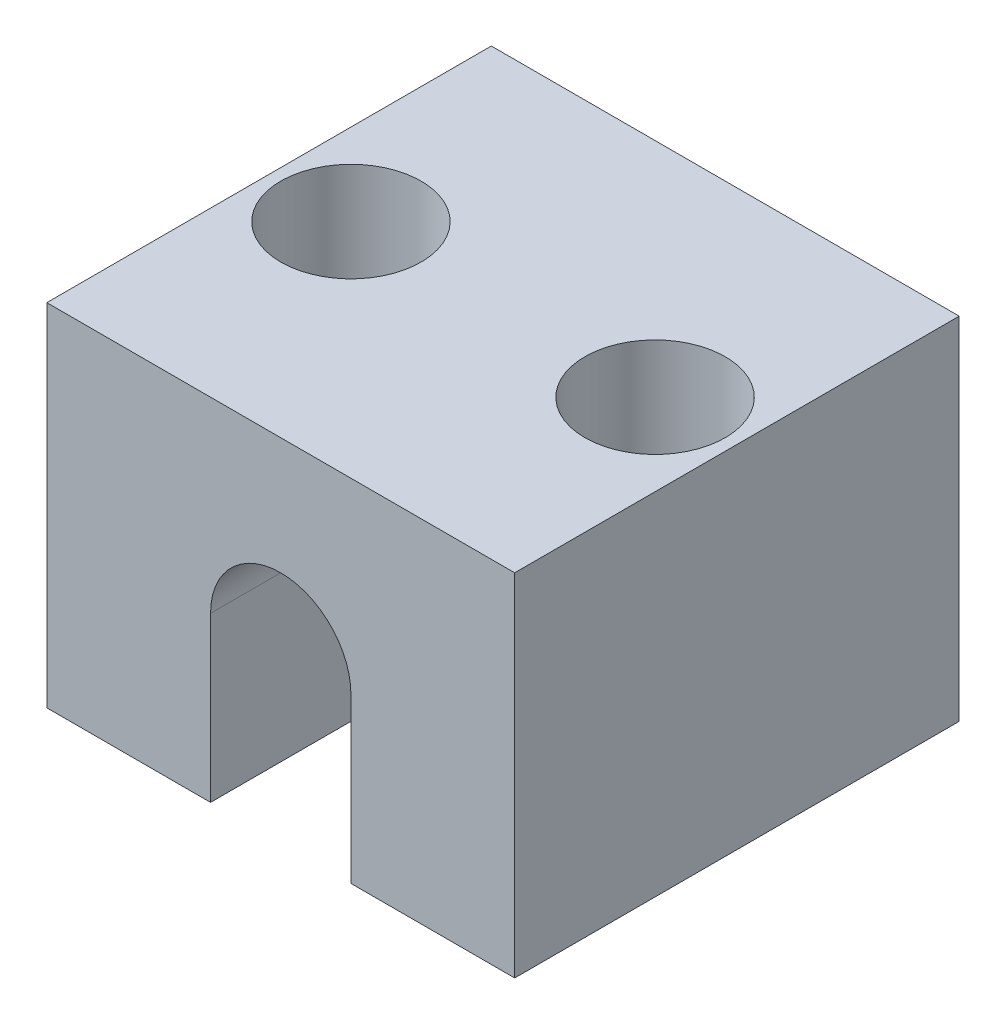
ISO-10303-21;
HEADER;
FILE_DESCRIPTION(('STEP AP214'),'2;1');
FILE_NAME('part.step','',(''),(''),'','','');
FILE_SCHEMA(('AUTOMOTIVE_DESIGN { 1 0 10303 214 1 1 1 1 }'));
ENDSEC;
DATA;
#1=APPLICATION_CONTEXT('core data for automotive mechanical design processes');
#2=APPLICATION_PROTOCOL_DEFINITION('international standard','automotive_design',2000,#1);
#3=PRODUCT_CONTEXT('',#1,'mechanical');
#4=PRODUCT('Part','Part','',(#3));
#5=PRODUCT_RELATED_PRODUCT_CATEGORY('part','',(#4));
#6=PRODUCT_DEFINITION_FORMATION('','',#4);
#7=PRODUCT_DEFINITION_CONTEXT('part definition',#1,'design');
#8=PRODUCT_DEFINITION('design','',#6,#7);
#9=PRODUCT_DEFINITION_SHAPE('','',#8);
#10=(LENGTH_UNIT() NAMED_UNIT(*) SI_UNIT(.MILLI.,.METRE.));
#11=(NAMED_UNIT(*) PLANE_ANGLE_UNIT() SI_UNIT($,.RADIAN.));
#12=(NAMED_UNIT(*) SI_UNIT($,.STERADIAN.) SOLID_ANGLE_UNIT());
#13=UNCERTAINTY_MEASURE_WITH_UNIT(LENGTH_MEASURE(1.E-05),#10,'distance_accuracy_value','');
#14=(GEOMETRIC_REPRESENTATION_CONTEXT(3) GLOBAL_UNCERTAINTY_ASSIGNED_CONTEXT((#13)) GLOBAL_UNIT_ASSIGNED_CONTEXT((#10,
#11,#12)) REPRESENTATION_CONTEXT('',''));
#15=CARTESIAN_POINT('',(0.,0.,0.));
#16=DIRECTION('',(0.,0.,1.));
#17=DIRECTION('',(1.,0.,0.));
#18=AXIS2_PLACEMENT_3D('',#15,#16,#17);
#19=CARTESIAN_POINT('',(-6.5,0.,9.5));
#20=DIRECTION('',(0.,1.,0.));
#21=DIRECTION('',(0.,0.,1.));
#22=AXIS2_PLACEMENT_3D('',#19,#20,#21);
#23=CYLINDRICAL_SURFACE('',#22,1.8);
#24=CARTESIAN_POINT('',(-6.5,0.,9.5));
#25=DIRECTION('',(0.,1.,0.));
#26=DIRECTION('',(0.,0.,1.));
#27=AXIS2_PLACEMENT_3D('',#24,#25,#26);
#28=CIRCLE('',#27,1.8);
#29=CARTESIAN_POINT('',(-6.5,0.,11.3));
#30=VERTEX_POINT('',#29);
#31=EDGE_CURVE('E135',#30,#30,#28,.T.);
#32=ORIENTED_EDGE('',*,*,#31,.F.);
#33=EDGE_LOOP('',(#32));
#34=FACE_BOUND('',#33,.T.);
#35=CARTESIAN_POINT('',(-6.5,3.,9.5));
#36=DIRECTION('',(0.,1.,0.));
#37=DIRECTION('',(0.,0.,1.));
#38=AXIS2_PLACEMENT_3D('',#35,#36,#37);
#39=CIRCLE('',#38,1.8);
#40=CARTESIAN_POINT('',(-6.5,3.,11.3));
#41=VERTEX_POINT('',#40);
#42=EDGE_CURVE('E233',#41,#41,#39,.F.);
#43=ORIENTED_EDGE('',*,*,#42,.F.);
#44=EDGE_LOOP('',(#43));
#45=FACE_BOUND('',#44,.T.);
#46=ADVANCED_FACE('F37',(#34,#45),#23,.F.);
#47=CARTESIAN_POINT('',(6.5,0.,9.5));
#48=DIRECTION('',(0.,1.,0.));
#49=DIRECTION('',(0.,0.,1.));
#50=AXIS2_PLACEMENT_3D('',#47,#48,#49);
#51=CYLINDRICAL_SURFACE('',#50,1.8);
#52=CARTESIAN_POINT('',(6.5,0.,9.5));
#53=DIRECTION('',(0.,1.,0.));
#54=DIRECTION('',(0.,0.,1.));
#55=AXIS2_PLACEMENT_3D('',#52,#53,#54);
#56=CIRCLE('',#55,1.8);
#57=CARTESIAN_POINT('',(6.5,0.,11.3));
#58=VERTEX_POINT('',#57);
#59=EDGE_CURVE('E179',#58,#58,#56,.T.);
#60=ORIENTED_EDGE('',*,*,#59,.F.);
#61=EDGE_LOOP('',(#60));
#62=FACE_BOUND('',#61,.T.);
#63=CARTESIAN_POINT('',(6.5,3.,9.5));
#64=DIRECTION('',(0.,1.,0.));
#65=DIRECTION('',(0.,0.,1.));
#66=AXIS2_PLACEMENT_3D('',#63,#64,#65);
#67=CIRCLE('',#66,1.8);
#68=CARTESIAN_POINT('',(6.5,3.,11.3));
#69=VERTEX_POINT('',#68);
#70=EDGE_CURVE('E235',#69,#69,#67,.F.);
#71=ORIENTED_EDGE('',*,*,#70,.F.);
#72=EDGE_LOOP('',(#71));
#73=FACE_BOUND('',#72,.T.);
#74=ADVANCED_FACE('F201',(#62,#73),#51,.F.);
#75=CARTESIAN_POINT('',(0.,7.,19.));
#76=DIRECTION('',(0.,0.,-1.));
#77=DIRECTION('',(-1.,0.,0.));
#78=AXIS2_PLACEMENT_3D('',#75,#76,#77);
#79=CYLINDRICAL_SURFACE('',#78,3.);
#80=CARTESIAN_POINT('',(0.,7.,0.));
#81=DIRECTION('',(0.,0.,1.));
#82=DIRECTION('',(1.,0.,0.));
#83=AXIS2_PLACEMENT_3D('',#80,#81,#82);
#84=CIRCLE('',#83,3.);
#85=CARTESIAN_POINT('',(3.,7.,0.));
#86=VERTEX_POINT('',#85);
#87=CARTESIAN_POINT('',(-3.,7.,0.));
#88=VERTEX_POINT('',#87);
#89=EDGE_CURVE('E131',#86,#88,#84,.T.);
#90=ORIENTED_EDGE('',*,*,#89,.F.);
#91=DIRECTION('',(0.,0.,-1.));
#92=VECTOR('',#91,1.);
#93=CARTESIAN_POINT('',(3.,7.,19.));
#94=LINE('',#93,#92);
#95=CARTESIAN_POINT('',(3.,7.,19.));
#96=VERTEX_POINT('',#95);
#97=EDGE_CURVE('E12',#96,#86,#94,.T.);
#98=ORIENTED_EDGE('',*,*,#97,.F.);
#99=CARTESIAN_POINT('',(0.,7.,19.));
#100=DIRECTION('',(0.,0.,1.));
#101=DIRECTION('',(1.,0.,0.));
#102=AXIS2_PLACEMENT_3D('',#99,#100,#101);
#103=CIRCLE('',#102,3.);
#104=CARTESIAN_POINT('',(-3.,7.,19.));
#105=VERTEX_POINT('',#104);
#106=EDGE_CURVE('E150',#96,#105,#103,.T.);
#107=ORIENTED_EDGE('',*,*,#106,.T.);
#108=DIRECTION('',(0.,0.,-1.));
#109=VECTOR('',#108,1.);
#110=CARTESIAN_POINT('',(-3.,7.,19.));
#111=LINE('',#110,#109);
#112=EDGE_CURVE('E88',#105,#88,#111,.T.);
#113=ORIENTED_EDGE('',*,*,#112,.T.);
#114=EDGE_LOOP('',(#90,#98,#107,#113));
#115=FACE_BOUND('',#114,.T.);
#116=ADVANCED_FACE('F39',(#115),#79,.F.);
#117=CARTESIAN_POINT('',(3.,0.,19.));
#118=DIRECTION('',(-1.,0.,0.));
#119=DIRECTION('',(0.,0.,1.));
#120=AXIS2_PLACEMENT_3D('',#117,#118,#119);
#121=PLANE('',#120);
#122=DIRECTION('',(0.,1.,0.));
#123=VECTOR('',#122,1.);
#124=CARTESIAN_POINT('',(3.,0.,0.));
#125=LINE('',#124,#123);
#126=CARTESIAN_POINT('',(3.,0.,0.));
#127=VERTEX_POINT('',#126);
#128=EDGE_CURVE('E134',#127,#86,#125,.T.);
#129=ORIENTED_EDGE('',*,*,#128,.F.);
#130=DIRECTION('',(0.,0.,-1.));
#131=VECTOR('',#130,1.);
#132=CARTESIAN_POINT('',(3.,0.,19.));
#133=LINE('',#132,#131);
#134=CARTESIAN_POINT('',(3.,0.,19.));
#135=VERTEX_POINT('',#134);
#136=EDGE_CURVE('E46',#135,#127,#133,.T.);
#137=ORIENTED_EDGE('',*,*,#136,.F.);
#138=DIRECTION('',(0.,1.,0.));
#139=VECTOR('',#138,1.);
#140=CARTESIAN_POINT('',(3.,0.,19.));
#141=LINE('',#140,#139);
#142=EDGE_CURVE('E172',#135,#96,#141,.T.);
#143=ORIENTED_EDGE('',*,*,#142,.T.);
#144=ORIENTED_EDGE('',*,*,#97,.T.);
#145=EDGE_LOOP('',(#129,#137,#143,#144));
#146=FACE_BOUND('',#145,.T.);
#147=ADVANCED_FACE('F171',(#146),#121,.T.);
#148=CARTESIAN_POINT('',(0.,0.,19.));
#149=DIRECTION('',(0.,1.,0.));
#150=DIRECTION('',(0.,0.,1.));
#151=AXIS2_PLACEMENT_3D('',#148,#149,#150);
#152=PLANE('',#151);
#153=ORIENTED_EDGE('',*,*,#59,.T.);
#154=EDGE_LOOP('',(#153));
#155=FACE_BOUND('',#154,.T.);
#156=DIRECTION('',(1.,0.,0.));
#157=VECTOR('',#156,1.);
#158=CARTESIAN_POINT('',(0.,0.,0.));
#159=LINE('',#158,#157);
#160=CARTESIAN_POINT('',(10.,0.,0.));
#161=VERTEX_POINT('',#160);
#162=EDGE_CURVE('E138',#127,#161,#159,.T.);
#163=ORIENTED_EDGE('',*,*,#162,.T.);
#164=DIRECTION('',(0.,0.,-1.));
#165=VECTOR('',#164,1.);
#166=CARTESIAN_POINT('',(10.,0.,19.));
#167=LINE('',#166,#165);
#168=CARTESIAN_POINT('',(10.,0.,19.));
#169=VERTEX_POINT('',#168);
#170=EDGE_CURVE('E156',#169,#161,#167,.T.);
#171=ORIENTED_EDGE('',*,*,#170,.F.);
#172=DIRECTION('',(1.,0.,0.));
#173=VECTOR('',#172,1.);
#174=CARTESIAN_POINT('',(0.,0.,19.));
#175=LINE('',#174,#173);
#176=EDGE_CURVE('E163',#135,#169,#175,.T.);
#177=ORIENTED_EDGE('',*,*,#176,.F.);
#178=ORIENTED_EDGE('',*,*,#136,.T.);
#179=EDGE_LOOP('',(#163,#171,#177,#178));
#180=FACE_BOUND('',#179,.T.);
#181=ADVANCED_FACE('F161',(#155,#180),#152,.F.);
#182=CARTESIAN_POINT('',(10.,0.,19.));
#183=DIRECTION('',(-1.,0.,0.));
#184=DIRECTION('',(0.,0.,1.));
#185=AXIS2_PLACEMENT_3D('',#182,#183,#184);
#186=PLANE('',#185);
#187=DIRECTION('',(0.,1.,0.));
#188=VECTOR('',#187,1.);
#189=CARTESIAN_POINT('',(10.,0.,0.));
#190=LINE('',#189,#188);
#191=CARTESIAN_POINT('',(10.,15.,0.));
#192=VERTEX_POINT('',#191);
#193=EDGE_CURVE('E140',#161,#192,#190,.T.);
#194=ORIENTED_EDGE('',*,*,#193,.T.);
#195=DIRECTION('',(0.,0.,-1.));
#196=VECTOR('',#195,1.);
#197=CARTESIAN_POINT('',(10.,15.,19.));
#198=LINE('',#197,#196);
#199=CARTESIAN_POINT('',(10.,15.,19.));
#200=VERTEX_POINT('',#199);
#201=EDGE_CURVE('E154',#200,#192,#198,.T.);
#202=ORIENTED_EDGE('',*,*,#201,.F.);
#203=DIRECTION('',(0.,1.,0.));
#204=VECTOR('',#203,1.);
#205=CARTESIAN_POINT('',(10.,0.,19.));
#206=LINE('',#205,#204);
#207=EDGE_CURVE('E126',#169,#200,#206,.T.);
#208=ORIENTED_EDGE('',*,*,#207,.F.);
#209=ORIENTED_EDGE('',*,*,#170,.T.);
#210=EDGE_LOOP('',(#194,#202,#208,#209));
#211=FACE_BOUND('',#210,.T.);
#212=ADVANCED_FACE('F185',(#211),#186,.F.);
#213=CARTESIAN_POINT('',(0.,15.,19.));
#214=DIRECTION('',(0.,1.,0.));
#215=DIRECTION('',(0.,0.,1.));
#216=AXIS2_PLACEMENT_3D('',#213,#214,#215);
#217=PLANE('',#216);
#218=CARTESIAN_POINT('',(-6.5,15.,9.5));
#219=DIRECTION('',(0.,1.,0.));
#220=DIRECTION('',(0.,0.,1.));
#221=AXIS2_PLACEMENT_3D('',#218,#219,#220);
#222=CIRCLE('',#221,3.);
#223=CARTESIAN_POINT('',(-6.5,15.,12.5));
#224=VERTEX_POINT('',#223);
#225=EDGE_CURVE('E242',#224,#224,#222,.T.);
#226=ORIENTED_EDGE('',*,*,#225,.F.);
#227=EDGE_LOOP('',(#226));
#228=FACE_BOUND('',#227,.T.);
#229=CARTESIAN_POINT('',(6.5,15.,9.5));
#230=DIRECTION('',(0.,1.,0.));
#231=DIRECTION('',(0.,0.,1.));
#232=AXIS2_PLACEMENT_3D('',#229,#230,#231);
#233=CIRCLE('',#232,3.);
#234=CARTESIAN_POINT('',(6.5,15.,12.5));
#235=VERTEX_POINT('',#234);
#236=EDGE_CURVE('E234',#235,#235,#233,.T.);
#237=ORIENTED_EDGE('',*,*,#236,.F.);
#238=EDGE_LOOP('',(#237));
#239=FACE_BOUND('',#238,.T.);
#240=DIRECTION('',(1.,0.,0.));
#241=VECTOR('',#240,1.);
#242=CARTESIAN_POINT('',(0.,15.,0.));
#243=LINE('',#242,#241);
#244=CARTESIAN_POINT('',(-10.,15.,0.));
#245=VERTEX_POINT('',#244);
#246=EDGE_CURVE('E143',#245,#192,#243,.T.);
#247=ORIENTED_EDGE('',*,*,#246,.F.);
#248=DIRECTION('',(0.,0.,-1.));
#249=VECTOR('',#248,1.);
#250=CARTESIAN_POINT('',(-10.,15.,19.));
#251=LINE('',#250,#249);
#252=CARTESIAN_POINT('',(-10.,15.,19.));
#253=VERTEX_POINT('',#252);
#254=EDGE_CURVE('E115',#253,#245,#251,.T.);
#255=ORIENTED_EDGE('',*,*,#254,.F.);
#256=DIRECTION('',(1.,0.,0.));
#257=VECTOR('',#256,1.);
#258=CARTESIAN_POINT('',(0.,15.,19.));
#259=LINE('',#258,#257);
#260=EDGE_CURVE('E124',#253,#200,#259,.T.);
#261=ORIENTED_EDGE('',*,*,#260,.T.);
#262=ORIENTED_EDGE('',*,*,#201,.T.);
#263=EDGE_LOOP('',(#247,#255,#261,#262));
#264=FACE_BOUND('',#263,.T.);
#265=ADVANCED_FACE('F188',(#228,#239,#264),#217,.T.);
#266=CARTESIAN_POINT('',(-10.,0.,19.));
#267=DIRECTION('',(-1.,0.,0.));
#268=DIRECTION('',(0.,0.,1.));
#269=AXIS2_PLACEMENT_3D('',#266,#267,#268);
#270=PLANE('',#269);
#271=DIRECTION('',(0.,1.,0.));
#272=VECTOR('',#271,1.);
#273=CARTESIAN_POINT('',(-10.,0.,0.));
#274=LINE('',#273,#272);
#275=CARTESIAN_POINT('',(-10.,0.,0.));
#276=VERTEX_POINT('',#275);
#277=EDGE_CURVE('E114',#276,#245,#274,.T.);
#278=ORIENTED_EDGE('',*,*,#277,.F.);
#279=DIRECTION('',(0.,0.,-1.));
#280=VECTOR('',#279,1.);
#281=CARTESIAN_POINT('',(-10.,0.,19.));
#282=LINE('',#281,#280);
#283=CARTESIAN_POINT('',(-10.,0.,19.));
#284=VERTEX_POINT('',#283);
#285=EDGE_CURVE('E108',#284,#276,#282,.T.);
#286=ORIENTED_EDGE('',*,*,#285,.F.);
#287=DIRECTION('',(0.,1.,0.));
#288=VECTOR('',#287,1.);
#289=CARTESIAN_POINT('',(-10.,0.,19.));
#290=LINE('',#289,#288);
#291=EDGE_CURVE('E112',#284,#253,#290,.T.);
#292=ORIENTED_EDGE('',*,*,#291,.T.);
#293=ORIENTED_EDGE('',*,*,#254,.T.);
#294=EDGE_LOOP('',(#278,#286,#292,#293));
#295=FACE_BOUND('',#294,.T.);
#296=ADVANCED_FACE('F110',(#295),#270,.T.);
#297=CARTESIAN_POINT('',(0.,0.,19.));
#298=DIRECTION('',(0.,1.,0.));
#299=DIRECTION('',(0.,0.,1.));
#300=AXIS2_PLACEMENT_3D('',#297,#298,#299);
#301=PLANE('',#300);
#302=ORIENTED_EDGE('',*,*,#31,.T.);
#303=EDGE_LOOP('',(#302));
#304=FACE_BOUND('',#303,.T.);
#305=DIRECTION('',(1.,0.,0.));
#306=VECTOR('',#305,1.);
#307=CARTESIAN_POINT('',(0.,0.,0.));
#308=LINE('',#307,#306);
#309=CARTESIAN_POINT('',(-3.,0.,0.));
#310=VERTEX_POINT('',#309);
#311=EDGE_CURVE('E81',#276,#310,#308,.T.);
#312=ORIENTED_EDGE('',*,*,#311,.T.);
#313=DIRECTION('',(0.,0.,-1.));
#314=VECTOR('',#313,1.);
#315=CARTESIAN_POINT('',(-3.,0.,19.));
#316=LINE('',#315,#314);
#317=CARTESIAN_POINT('',(-3.,0.,19.));
#318=VERTEX_POINT('',#317);
#319=EDGE_CURVE('E116',#318,#310,#316,.T.);
#320=ORIENTED_EDGE('',*,*,#319,.F.);
#321=DIRECTION('',(1.,0.,0.));
#322=VECTOR('',#321,1.);
#323=CARTESIAN_POINT('',(0.,0.,19.));
#324=LINE('',#323,#322);
#325=EDGE_CURVE('E118',#284,#318,#324,.T.);
#326=ORIENTED_EDGE('',*,*,#325,.F.);
#327=ORIENTED_EDGE('',*,*,#285,.T.);
#328=EDGE_LOOP('',(#312,#320,#326,#327));
#329=FACE_BOUND('',#328,.T.);
#330=ADVANCED_FACE('F119',(#304,#329),#301,.F.);
#331=CARTESIAN_POINT('',(-3.,0.,19.));
#332=DIRECTION('',(-1.,0.,0.));
#333=DIRECTION('',(0.,0.,1.));
#334=AXIS2_PLACEMENT_3D('',#331,#332,#333);
#335=PLANE('',#334);
#336=DIRECTION('',(0.,1.,0.));
#337=VECTOR('',#336,1.);
#338=CARTESIAN_POINT('',(-3.,0.,0.));
#339=LINE('',#338,#337);
#340=EDGE_CURVE('E148',#310,#88,#339,.T.);
#341=ORIENTED_EDGE('',*,*,#340,.T.);
#342=ORIENTED_EDGE('',*,*,#112,.F.);
#343=DIRECTION('',(0.,1.,0.));
#344=VECTOR('',#343,1.);
#345=CARTESIAN_POINT('',(-3.,0.,19.));
#346=LINE('',#345,#344);
#347=EDGE_CURVE('E54',#318,#105,#346,.T.);
#348=ORIENTED_EDGE('',*,*,#347,.F.);
#349=ORIENTED_EDGE('',*,*,#319,.T.);
#350=EDGE_LOOP('',(#341,#342,#348,#349));
#351=FACE_BOUND('',#350,.T.);
#352=ADVANCED_FACE('F175',(#351),#335,.F.);
#353=CARTESIAN_POINT('',(0.,0.,19.));
#354=DIRECTION('',(0.,0.,1.));
#355=DIRECTION('',(1.,0.,0.));
#356=AXIS2_PLACEMENT_3D('',#353,#354,#355);
#357=PLANE('',#356);
#358=ORIENTED_EDGE('',*,*,#106,.F.);
#359=ORIENTED_EDGE('',*,*,#142,.F.);
#360=ORIENTED_EDGE('',*,*,#176,.T.);
#361=ORIENTED_EDGE('',*,*,#207,.T.);
#362=ORIENTED_EDGE('',*,*,#260,.F.);
#363=ORIENTED_EDGE('',*,*,#291,.F.);
#364=ORIENTED_EDGE('',*,*,#325,.T.);
#365=ORIENTED_EDGE('',*,*,#347,.T.);
#366=EDGE_LOOP('',(#358,#359,#360,#361,#362,#363,#364,#365));
#367=FACE_BOUND('',#366,.T.);
#368=ADVANCED_FACE('F122',(#367),#357,.T.);
#369=CARTESIAN_POINT('',(0.,0.,0.));
#370=DIRECTION('',(0.,0.,1.));
#371=DIRECTION('',(1.,0.,0.));
#372=AXIS2_PLACEMENT_3D('',#369,#370,#371);
#373=PLANE('',#372);
#374=ORIENTED_EDGE('',*,*,#89,.T.);
#375=ORIENTED_EDGE('',*,*,#340,.F.);
#376=ORIENTED_EDGE('',*,*,#311,.F.);
#377=ORIENTED_EDGE('',*,*,#277,.T.);
#378=ORIENTED_EDGE('',*,*,#246,.T.);
#379=ORIENTED_EDGE('',*,*,#193,.F.);
#380=ORIENTED_EDGE('',*,*,#162,.F.);
#381=ORIENTED_EDGE('',*,*,#128,.T.);
#382=EDGE_LOOP('',(#374,#375,#376,#377,#378,#379,#380,#381));
#383=FACE_BOUND('',#382,.T.);
#384=ADVANCED_FACE('F170',(#383),#373,.F.);
#385=CARTESIAN_POINT('',(6.5,-8.48528137423857,9.5));
#386=DIRECTION('',(0.,1.,0.));
#387=DIRECTION('',(0.,0.,1.));
#388=AXIS2_PLACEMENT_3D('',#385,#386,#387);
#389=CYLINDRICAL_SURFACE('',#388,3.);
#390=CARTESIAN_POINT('',(6.5,3.,9.5));
#391=DIRECTION('',(0.,1.,0.));
#392=DIRECTION('',(0.,0.,1.));
#393=AXIS2_PLACEMENT_3D('',#390,#391,#392);
#394=CIRCLE('',#393,3.);
#395=CARTESIAN_POINT('',(6.5,3.,12.5));
#396=VERTEX_POINT('',#395);
#397=EDGE_CURVE('E230',#396,#396,#394,.F.);
#398=ORIENTED_EDGE('',*,*,#397,.T.);
#399=EDGE_LOOP('',(#398));
#400=FACE_BOUND('',#399,.T.);
#401=ORIENTED_EDGE('',*,*,#236,.T.);
#402=EDGE_LOOP('',(#401));
#403=FACE_BOUND('',#402,.T.);
#404=ADVANCED_FACE('F219',(#400,#403),#389,.F.);
#405=CARTESIAN_POINT('',(0.,3.,19.));
#406=DIRECTION('',(0.,1.,0.));
#407=DIRECTION('',(0.,0.,1.));
#408=AXIS2_PLACEMENT_3D('',#405,#406,#407);
#409=PLANE('',#408);
#410=ORIENTED_EDGE('',*,*,#397,.F.);
#411=EDGE_LOOP('',(#410));
#412=FACE_BOUND('',#411,.T.);
#413=ORIENTED_EDGE('',*,*,#70,.T.);
#414=EDGE_LOOP('',(#413));
#415=FACE_BOUND('',#414,.T.);
#416=ADVANCED_FACE('F212',(#412,#415),#409,.T.);
#417=CARTESIAN_POINT('',(-6.5,-8.48528137423857,9.5));
#418=DIRECTION('',(0.,1.,0.));
#419=DIRECTION('',(0.,0.,1.));
#420=AXIS2_PLACEMENT_3D('',#417,#418,#419);
#421=CYLINDRICAL_SURFACE('',#420,3.);
#422=CARTESIAN_POINT('',(-6.5,3.,9.5));
#423=DIRECTION('',(0.,1.,0.));
#424=DIRECTION('',(0.,0.,1.));
#425=AXIS2_PLACEMENT_3D('',#422,#423,#424);
#426=CIRCLE('',#425,3.);
#427=CARTESIAN_POINT('',(-6.5,3.,12.5));
#428=VERTEX_POINT('',#427);
#429=EDGE_CURVE('E228',#428,#428,#426,.F.);
#430=ORIENTED_EDGE('',*,*,#429,.T.);
#431=EDGE_LOOP('',(#430));
#432=FACE_BOUND('',#431,.T.);
#433=ORIENTED_EDGE('',*,*,#225,.T.);
#434=EDGE_LOOP('',(#433));
#435=FACE_BOUND('',#434,.T.);
#436=ADVANCED_FACE('F247',(#432,#435),#421,.F.);
#437=CARTESIAN_POINT('',(0.,3.,19.));
#438=DIRECTION('',(0.,1.,0.));
#439=DIRECTION('',(0.,0.,1.));
#440=AXIS2_PLACEMENT_3D('',#437,#438,#439);
#441=PLANE('',#440);
#442=ORIENTED_EDGE('',*,*,#429,.F.);
#443=EDGE_LOOP('',(#442));
#444=FACE_BOUND('',#443,.T.);
#445=ORIENTED_EDGE('',*,*,#42,.T.);
#446=EDGE_LOOP('',(#445));
#447=FACE_BOUND('',#446,.T.);
#448=ADVANCED_FACE('F249',(#444,#447),#441,.T.);
#449=CLOSED_SHELL('',(#46,#74,#116,#147,#181,#212,#265,#296,#330,#352,#368,#384,#404,#416,#436,#448));
#450=MANIFOLD_SOLID_BREP('B2',#449);
#451=ADVANCED_BREP_SHAPE_REPRESENTATION('',(#18,#450),#14);
#452=SHAPE_DEFINITION_REPRESENTATION(#9,#451);
ENDSEC;
END-ISO-10303-21;
